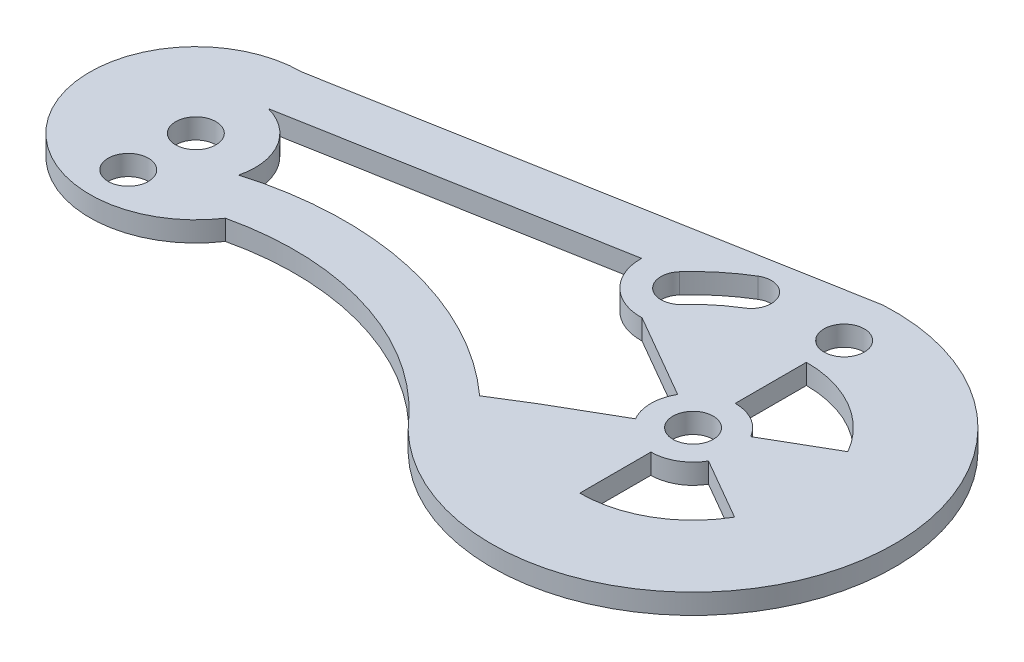
ISO-10303-21;
HEADER;
FILE_DESCRIPTION(('STEP AP214'),'2;1');
FILE_NAME('part.step','',(''),(''),'','','');
FILE_SCHEMA(('AUTOMOTIVE_DESIGN { 1 0 10303 214 1 1 1 1 }'));
ENDSEC;
DATA;
#1=APPLICATION_CONTEXT('core data for automotive mechanical design processes');
#2=APPLICATION_PROTOCOL_DEFINITION('international standard','automotive_design',2000,#1);
#3=PRODUCT_CONTEXT('',#1,'mechanical');
#4=PRODUCT('Part','Part','',(#3));
#5=PRODUCT_RELATED_PRODUCT_CATEGORY('part','',(#4));
#6=PRODUCT_DEFINITION_FORMATION('','',#4);
#7=PRODUCT_DEFINITION_CONTEXT('part definition',#1,'design');
#8=PRODUCT_DEFINITION('design','',#6,#7);
#9=PRODUCT_DEFINITION_SHAPE('','',#8);
#10=(LENGTH_UNIT() NAMED_UNIT(*) SI_UNIT(.MILLI.,.METRE.));
#11=(NAMED_UNIT(*) PLANE_ANGLE_UNIT() SI_UNIT($,.RADIAN.));
#12=(NAMED_UNIT(*) SI_UNIT($,.STERADIAN.) SOLID_ANGLE_UNIT());
#13=UNCERTAINTY_MEASURE_WITH_UNIT(LENGTH_MEASURE(1.E-05),#10,'distance_accuracy_value','');
#14=(GEOMETRIC_REPRESENTATION_CONTEXT(3) GLOBAL_UNCERTAINTY_ASSIGNED_CONTEXT((#13)) GLOBAL_UNIT_ASSIGNED_CONTEXT((#10,
#11,#12)) REPRESENTATION_CONTEXT('',''));
#15=CARTESIAN_POINT('',(0.,0.,0.));
#16=DIRECTION('',(0.,0.,1.));
#17=DIRECTION('',(1.,0.,0.));
#18=AXIS2_PLACEMENT_3D('',#15,#16,#17);
#19=CARTESIAN_POINT('',(16.3199445973894,2.,-0.0149493146589817));
#20=DIRECTION('',(0.,1.,0.));
#21=DIRECTION('',(0.,0.,1.));
#22=AXIS2_PLACEMENT_3D('',#19,#20,#21);
#23=PLANE('',#22);
#24=DIRECTION('',(0.866025403784441,0.,-0.499999999999995));
#25=VECTOR('',#24,1.);
#26=CARTESIAN_POINT('',(19.9455703845448,2.,-2.10820533885399));
#27=LINE('',#26,#25);
#28=CARTESIAN_POINT('',(19.9455703845448,2.,-2.10820533885399));
#29=VERTEX_POINT('',#28);
#30=CARTESIAN_POINT('',(26.0642912359516,2.,-5.64085046950984));
#31=VERTEX_POINT('',#30);
#32=EDGE_CURVE('E232',#29,#31,#27,.T.);
#33=ORIENTED_EDGE('',*,*,#32,.F.);
#34=CARTESIAN_POINT('',(16.3199445973894,2.,-0.0149493146589817));
#35=DIRECTION('',(0.,-1.,0.));
#36=DIRECTION('',(0.,0.,1.));
#37=AXIS2_PLACEMENT_3D('',#34,#35,#36);
#38=CIRCLE('',#37,4.18651204839007);
#39=CARTESIAN_POINT('',(16.3199445973894,2.,-4.20146136304906));
#40=VERTEX_POINT('',#39);
#41=EDGE_CURVE('E230',#40,#29,#38,.T.);
#42=ORIENTED_EDGE('',*,*,#41,.F.);
#43=DIRECTION('',(0.,0.,1.));
#44=VECTOR('',#43,1.);
#45=CARTESIAN_POINT('',(16.3199445973894,2.,-4.20146136304906));
#46=LINE('',#45,#44);
#47=CARTESIAN_POINT('',(16.3199445973894,2.,-11.2667516243608));
#48=VERTEX_POINT('',#47);
#49=EDGE_CURVE('E238',#48,#40,#46,.T.);
#50=ORIENTED_EDGE('',*,*,#49,.F.);
#51=CARTESIAN_POINT('',(16.3199445973894,2.,-0.0149493146589817));
#52=DIRECTION('',(0.,1.,0.));
#53=DIRECTION('',(0.,0.,1.));
#54=AXIS2_PLACEMENT_3D('',#51,#52,#53);
#55=CIRCLE('',#54,11.2518023097018);
#56=EDGE_CURVE('E235',#31,#48,#55,.T.);
#57=ORIENTED_EDGE('',*,*,#56,.F.);
#58=EDGE_LOOP('',(#33,#42,#50,#57));
#59=FACE_BOUND('',#58,.T.);
#60=CARTESIAN_POINT('',(16.3199445973896,2.,-15.0149493146594));
#61=DIRECTION('',(0.,1.,0.));
#62=DIRECTION('',(0.,0.,1.));
#63=AXIS2_PLACEMENT_3D('',#60,#61,#62);
#64=CIRCLE('',#63,2.);
#65=CARTESIAN_POINT('',(16.3199445973896,2.,-13.0149493146594));
#66=VERTEX_POINT('',#65);
#67=EDGE_CURVE('E320',#66,#66,#64,.T.);
#68=ORIENTED_EDGE('',*,*,#67,.F.);
#69=EDGE_LOOP('',(#68));
#70=FACE_BOUND('',#69,.T.);
#71=CARTESIAN_POINT('',(16.3199445973894,2.,-0.0149493146589817));
#72=DIRECTION('',(0.,-1.,0.));
#73=DIRECTION('',(0.,0.,1.));
#74=AXIS2_PLACEMENT_3D('',#71,#72,#73);
#75=CIRCLE('',#74,14.9944903727053);
#76=CARTESIAN_POINT('',(5.20602798210394,2.,-10.0805143264025));
#77=VERTEX_POINT('',#76);
#78=CARTESIAN_POINT('',(8.56935246180486,2.,-12.8509558231089));
#79=VERTEX_POINT('',#78);
#80=EDGE_CURVE('E337',#77,#79,#75,.T.);
#81=ORIENTED_EDGE('',*,*,#80,.F.);
#82=CARTESIAN_POINT('',(3.72538472664067,2.,-11.4214917210473));
#83=DIRECTION('',(0.,1.,0.));
#84=DIRECTION('',(0.,0.,1.));
#85=AXIS2_PLACEMENT_3D('',#82,#83,#84);
#86=CIRCLE('',#85,1.99762980126381);
#87=CARTESIAN_POINT('',(2.24474147117739,2.,-12.7624691156921));
#88=VERTEX_POINT('',#87);
#89=EDGE_CURVE('E334',#88,#77,#86,.T.);
#90=ORIENTED_EDGE('',*,*,#89,.F.);
#91=CARTESIAN_POINT('',(16.3199445973894,2.,-0.0149493146589817));
#92=DIRECTION('',(0.,1.,0.));
#93=DIRECTION('',(0.,0.,1.));
#94=AXIS2_PLACEMENT_3D('',#91,#92,#93);
#95=CIRCLE('',#94,18.989749975233);
#96=CARTESIAN_POINT('',(6.50421874366688,2.,-16.2710906183763));
#97=VERTEX_POINT('',#96);
#98=EDGE_CURVE('E332',#97,#88,#95,.T.);
#99=ORIENTED_EDGE('',*,*,#98,.F.);
#100=CARTESIAN_POINT('',(7.53678560273587,2.,-14.5610232207426));
#101=DIRECTION('',(0.,1.,0.));
#102=DIRECTION('',(0.,0.,1.));
#103=AXIS2_PLACEMENT_3D('',#100,#101,#102);
#104=CIRCLE('',#103,1.99762980126382);
#105=EDGE_CURVE('E339',#79,#97,#104,.T.);
#106=ORIENTED_EDGE('',*,*,#105,.F.);
#107=EDGE_LOOP('',(#81,#90,#99,#106));
#108=FACE_BOUND('',#107,.T.);
#109=CARTESIAN_POINT('',(-33.6760270550272,2.,-0.649629179440625));
#110=DIRECTION('',(0.,1.,0.));
#111=DIRECTION('',(0.,0.,1.));
#112=AXIS2_PLACEMENT_3D('',#109,#110,#111);
#113=CIRCLE('',#112,2.00000000000008);
#114=CARTESIAN_POINT('',(-33.6760270550272,2.,1.35037082055946));
#115=VERTEX_POINT('',#114);
#116=EDGE_CURVE('E369',#115,#115,#113,.T.);
#117=ORIENTED_EDGE('',*,*,#116,.F.);
#118=EDGE_LOOP('',(#117));
#119=FACE_BOUND('',#118,.T.);
#120=CARTESIAN_POINT('',(16.3199445973894,2.,-0.0149493146589817));
#121=DIRECTION('',(0.,1.,0.));
#122=DIRECTION('',(0.,0.,1.));
#123=AXIS2_PLACEMENT_3D('',#120,#121,#122);
#124=CIRCLE('',#123,20.);
#125=CARTESIAN_POINT('',(1.21179098720079,2.,13.0901525350385));
#126=VERTEX_POINT('',#125);
#127=CARTESIAN_POINT('',(15.2114066280616,2.,-19.9842042724829));
#128=VERTEX_POINT('',#127);
#129=EDGE_CURVE('E375',#126,#128,#124,.T.);
#130=ORIENTED_EDGE('',*,*,#129,.T.);
#131=DIRECTION('',(-0.984169688292326,0.,0.177228735386181));
#132=VECTOR('',#131,1.);
#133=CARTESIAN_POINT('',(-33.6760270550272,2.,-11.1805821420723));
#134=LINE('',#133,#132);
#135=CARTESIAN_POINT('',(-33.6760270550272,2.,-11.1805821420723));
#136=VERTEX_POINT('',#135);
#137=EDGE_CURVE('E378',#128,#136,#134,.T.);
#138=ORIENTED_EDGE('',*,*,#137,.T.);
#139=CARTESIAN_POINT('',(-33.6760270550272,2.,-0.649629179440625));
#140=DIRECTION('',(0.,1.,0.));
#141=DIRECTION('',(0.,0.,1.));
#142=AXIS2_PLACEMENT_3D('',#139,#140,#141);
#143=CIRCLE('',#142,10.5309529626316);
#144=CARTESIAN_POINT('',(-24.9123676121906,2.,5.189826571838));
#145=VERTEX_POINT('',#144);
#146=EDGE_CURVE('E381',#136,#145,#143,.T.);
#147=ORIENTED_EDGE('',*,*,#146,.T.);
#148=CARTESIAN_POINT('',(-18.7219674602419,2.,31.8627021017618));
#149=DIRECTION('',(0.,-1.,0.));
#150=DIRECTION('',(0.,0.,-1.));
#151=AXIS2_PLACEMENT_3D('',#148,#149,#150);
#152=CIRCLE('',#151,27.3818067898391);
#153=EDGE_CURVE('E383',#145,#126,#152,.T.);
#154=ORIENTED_EDGE('',*,*,#153,.T.);
#155=EDGE_LOOP('',(#130,#138,#147,#154));
#156=FACE_BOUND('',#155,.T.);
#157=CARTESIAN_POINT('',(-33.8862251489053,2.,5.84697122087106));
#158=DIRECTION('',(0.,1.,0.));
#159=DIRECTION('',(0.,0.,1.));
#160=AXIS2_PLACEMENT_3D('',#157,#158,#159);
#161=CIRCLE('',#160,2.00000000000009);
#162=CARTESIAN_POINT('',(-33.8862251489053,2.,7.84697122087116));
#163=VERTEX_POINT('',#162);
#164=EDGE_CURVE('E363',#163,#163,#161,.T.);
#165=ORIENTED_EDGE('',*,*,#164,.F.);
#166=EDGE_LOOP('',(#165));
#167=FACE_BOUND('',#166,.T.);
#168=CARTESIAN_POINT('',(16.3199445973894,2.,-0.0149493146589817));
#169=DIRECTION('',(0.,1.,0.));
#170=DIRECTION('',(0.,0.,1.));
#171=AXIS2_PLACEMENT_3D('',#168,#169,#170);
#172=CIRCLE('',#171,2.00000000000038);
#173=CARTESIAN_POINT('',(16.3199445973894,2.,1.9850506853414));
#174=VERTEX_POINT('',#173);
#175=EDGE_CURVE('E326',#174,#174,#172,.T.);
#176=ORIENTED_EDGE('',*,*,#175,.F.);
#177=EDGE_LOOP('',(#176));
#178=FACE_BOUND('',#177,.T.);
#179=DIRECTION('',(0.850040839509949,0.,-0.526716784586575));
#180=VECTOR('',#179,1.);
#181=CARTESIAN_POINT('',(6.57559795882709,2.,5.61095184019181));
#182=LINE('',#181,#180);
#183=CARTESIAN_POINT('',(2.98633728253268,2.,7.83499067996181));
#184=VERTEX_POINT('',#183);
#185=CARTESIAN_POINT('',(6.57559795882709,2.,5.61095184019181));
#186=VERTEX_POINT('',#185);
#187=EDGE_CURVE('E263',#184,#186,#182,.T.);
#188=ORIENTED_EDGE('',*,*,#187,.F.);
#189=CARTESIAN_POINT('',(-18.7219674602419,2.,31.8627021017618));
#190=DIRECTION('',(0.,-1.,0.));
#191=DIRECTION('',(0.,0.,-1.));
#192=AXIS2_PLACEMENT_3D('',#189,#190,#191);
#193=CIRCLE('',#192,32.3818067898391);
#194=CARTESIAN_POINT('',(-27.9625677954776,2.,0.827355858825978));
#195=VERTEX_POINT('',#194);
#196=EDGE_CURVE('E261',#195,#184,#193,.T.);
#197=ORIENTED_EDGE('',*,*,#196,.F.);
#198=CARTESIAN_POINT('',(-33.6760270550272,2.,-0.649629179440625));
#199=DIRECTION('',(0.,-1.,0.));
#200=DIRECTION('',(0.,0.,1.));
#201=AXIS2_PLACEMENT_3D('',#198,#199,#200);
#202=CIRCLE('',#201,5.90127965053317);
#203=CARTESIAN_POINT('',(-32.2059919289702,2.,-6.36488055116134));
#204=VERTEX_POINT('',#203);
#205=EDGE_CURVE('E277',#204,#195,#202,.T.);
#206=ORIENTED_EDGE('',*,*,#205,.F.);
#207=DIRECTION('',(-0.984169688292328,0.,0.177228735386174));
#208=VECTOR('',#207,1.);
#209=CARTESIAN_POINT('',(-32.2059919289702,2.,-6.36488055116134));
#210=LINE('',#209,#208);
#211=CARTESIAN_POINT('',(-0.796707678042967,2.,-12.0210471588076));
#212=VERTEX_POINT('',#211);
#213=EDGE_CURVE('E274',#212,#204,#210,.T.);
#214=ORIENTED_EDGE('',*,*,#213,.F.);
#215=CARTESIAN_POINT('',(4.19999064817985,2.,-11.9245615785259));
#216=DIRECTION('',(0.,-1.,0.));
#217=DIRECTION('',(0.,0.,1.));
#218=AXIS2_PLACEMENT_3D('',#215,#216,#217);
#219=CIRCLE('',#218,4.99762980126381);
#220=CARTESIAN_POINT('',(4.34442408796202,2.,-6.92901930446264));
#221=VERTEX_POINT('',#220);
#222=EDGE_CURVE('E272',#221,#212,#219,.T.);
#223=ORIENTED_EDGE('',*,*,#222,.F.);
#224=DIRECTION('',(-0.866025403784442,0.,-0.499999999999995));
#225=VECTOR('',#224,1.);
#226=CARTESIAN_POINT('',(12.6943188102339,2.,-2.10820533885399));
#227=LINE('',#226,#225);
#228=CARTESIAN_POINT('',(12.6943188102339,2.,-2.10820533885399));
#229=VERTEX_POINT('',#228);
#230=EDGE_CURVE('E270',#229,#221,#227,.T.);
#231=ORIENTED_EDGE('',*,*,#230,.F.);
#232=CARTESIAN_POINT('',(16.3199445973894,2.,-0.0149493146589817));
#233=DIRECTION('',(0.,-1.,0.));
#234=DIRECTION('',(0.,0.,1.));
#235=AXIS2_PLACEMENT_3D('',#232,#233,#234);
#236=CIRCLE('',#235,4.18651204839007);
#237=CARTESIAN_POINT('',(12.6943188102339,2.,2.07830670953601));
#238=VERTEX_POINT('',#237);
#239=EDGE_CURVE('E268',#238,#229,#236,.T.);
#240=ORIENTED_EDGE('',*,*,#239,.F.);
#241=DIRECTION('',(0.866025403784445,0.,-0.499999999999989));
#242=VECTOR('',#241,1.);
#243=CARTESIAN_POINT('',(12.6943188102339,2.,2.07830670953601));
#244=LINE('',#243,#242);
#245=EDGE_CURVE('E266',#186,#238,#244,.T.);
#246=ORIENTED_EDGE('',*,*,#245,.F.);
#247=EDGE_LOOP('',(#188,#197,#206,#214,#223,#231,#240,#246));
#248=FACE_BOUND('',#247,.T.);
#249=DIRECTION('',(0.,0.,1.));
#250=VECTOR('',#249,1.);
#251=CARTESIAN_POINT('',(16.3199445973893,2.,4.17156273373109));
#252=LINE('',#251,#250);
#253=CARTESIAN_POINT('',(16.3199445973893,2.,4.17156273373109));
#254=VERTEX_POINT('',#253);
#255=CARTESIAN_POINT('',(16.3199445973893,2.,11.2368529950429));
#256=VERTEX_POINT('',#255);
#257=EDGE_CURVE('E202',#254,#256,#252,.T.);
#258=ORIENTED_EDGE('',*,*,#257,.F.);
#259=CARTESIAN_POINT('',(16.3199445973894,2.,-0.0149493146589817));
#260=DIRECTION('',(0.,-1.,0.));
#261=DIRECTION('',(0.,0.,1.));
#262=AXIS2_PLACEMENT_3D('',#259,#260,#261);
#263=CIRCLE('',#262,4.18651204839007);
#264=CARTESIAN_POINT('',(19.9455703845448,2.,2.07830670953609));
#265=VERTEX_POINT('',#264);
#266=EDGE_CURVE('E194',#265,#254,#263,.T.);
#267=ORIENTED_EDGE('',*,*,#266,.F.);
#268=DIRECTION('',(-0.866025403784438,0.,-0.500000000000001));
#269=VECTOR('',#268,1.);
#270=CARTESIAN_POINT('',(19.9455703845448,2.,2.07830670953609));
#271=LINE('',#270,#269);
#272=CARTESIAN_POINT('',(26.0642912359516,2.,5.61095184019197));
#273=VERTEX_POINT('',#272);
#274=EDGE_CURVE('E216',#273,#265,#271,.T.);
#275=ORIENTED_EDGE('',*,*,#274,.F.);
#276=CARTESIAN_POINT('',(16.3199445973894,2.,-0.0149493146589817));
#277=DIRECTION('',(0.,1.,0.));
#278=DIRECTION('',(0.,0.,1.));
#279=AXIS2_PLACEMENT_3D('',#276,#277,#278);
#280=CIRCLE('',#279,11.2518023097018);
#281=EDGE_CURVE('E214',#256,#273,#280,.T.);
#282=ORIENTED_EDGE('',*,*,#281,.F.);
#283=EDGE_LOOP('',(#258,#267,#275,#282));
#284=FACE_BOUND('',#283,.T.);
#285=ADVANCED_FACE('F33',(#59,#70,#108,#119,#156,#167,#178,#248,#284),#23,.T.);
#286=CARTESIAN_POINT('',(16.3199445973894,0.,-0.0149493146589817));
#287=DIRECTION('',(0.,1.,0.));
#288=DIRECTION('',(0.,0.,1.));
#289=AXIS2_PLACEMENT_3D('',#286,#287,#288);
#290=PLANE('',#289);
#291=CARTESIAN_POINT('',(16.3199445973894,0.,-0.0149493146589817));
#292=DIRECTION('',(0.,-1.,0.));
#293=DIRECTION('',(0.,0.,1.));
#294=AXIS2_PLACEMENT_3D('',#291,#292,#293);
#295=CIRCLE('',#294,4.18651204839007);
#296=CARTESIAN_POINT('',(16.3199445973894,0.,-4.20146136304906));
#297=VERTEX_POINT('',#296);
#298=CARTESIAN_POINT('',(19.9455703845448,0.,-2.10820533885399));
#299=VERTEX_POINT('',#298);
#300=EDGE_CURVE('E210',#297,#299,#295,.T.);
#301=ORIENTED_EDGE('',*,*,#300,.T.);
#302=DIRECTION('',(0.866025403784441,0.,-0.499999999999995));
#303=VECTOR('',#302,1.);
#304=CARTESIAN_POINT('',(19.9455703845448,0.,-2.10820533885399));
#305=LINE('',#304,#303);
#306=CARTESIAN_POINT('',(26.0642912359516,0.,-5.64085046950984));
#307=VERTEX_POINT('',#306);
#308=EDGE_CURVE('E243',#299,#307,#305,.T.);
#309=ORIENTED_EDGE('',*,*,#308,.T.);
#310=CARTESIAN_POINT('',(16.3199445973894,0.,-0.0149493146589817));
#311=DIRECTION('',(0.,1.,0.));
#312=DIRECTION('',(0.,0.,1.));
#313=AXIS2_PLACEMENT_3D('',#310,#311,#312);
#314=CIRCLE('',#313,11.2518023097018);
#315=CARTESIAN_POINT('',(16.3199445973894,0.,-11.2667516243608));
#316=VERTEX_POINT('',#315);
#317=EDGE_CURVE('E246',#307,#316,#314,.T.);
#318=ORIENTED_EDGE('',*,*,#317,.T.);
#319=DIRECTION('',(0.,0.,1.));
#320=VECTOR('',#319,1.);
#321=CARTESIAN_POINT('',(16.3199445973894,0.,-4.20146136304906));
#322=LINE('',#321,#320);
#323=EDGE_CURVE('E233',#316,#297,#322,.T.);
#324=ORIENTED_EDGE('',*,*,#323,.T.);
#325=EDGE_LOOP('',(#301,#309,#318,#324));
#326=FACE_BOUND('',#325,.T.);
#327=CARTESIAN_POINT('',(16.3199445973896,0.,-15.0149493146594));
#328=DIRECTION('',(0.,1.,0.));
#329=DIRECTION('',(0.,0.,1.));
#330=AXIS2_PLACEMENT_3D('',#327,#328,#329);
#331=CIRCLE('',#330,2.);
#332=CARTESIAN_POINT('',(16.3199445973896,0.,-13.0149493146594));
#333=VERTEX_POINT('',#332);
#334=EDGE_CURVE('E319',#333,#333,#331,.T.);
#335=ORIENTED_EDGE('',*,*,#334,.T.);
#336=EDGE_LOOP('',(#335));
#337=FACE_BOUND('',#336,.T.);
#338=CARTESIAN_POINT('',(3.72538472664067,0.,-11.4214917210473));
#339=DIRECTION('',(0.,1.,0.));
#340=DIRECTION('',(0.,0.,1.));
#341=AXIS2_PLACEMENT_3D('',#338,#339,#340);
#342=CIRCLE('',#341,1.99762980126381);
#343=CARTESIAN_POINT('',(2.24474147117738,0.,-12.7624691156921));
#344=VERTEX_POINT('',#343);
#345=CARTESIAN_POINT('',(5.20602798210394,0.,-10.0805143264025));
#346=VERTEX_POINT('',#345);
#347=EDGE_CURVE('E329',#344,#346,#342,.T.);
#348=ORIENTED_EDGE('',*,*,#347,.T.);
#349=CARTESIAN_POINT('',(16.3199445973894,0.,-0.0149493146589817));
#350=DIRECTION('',(0.,-1.,0.));
#351=DIRECTION('',(0.,0.,-1.));
#352=AXIS2_PLACEMENT_3D('',#349,#350,#351);
#353=CIRCLE('',#352,14.9944903727053);
#354=CARTESIAN_POINT('',(8.56935246180486,0.,-12.8509558231089));
#355=VERTEX_POINT('',#354);
#356=EDGE_CURVE('E345',#346,#355,#353,.T.);
#357=ORIENTED_EDGE('',*,*,#356,.T.);
#358=CARTESIAN_POINT('',(7.53678560273587,0.,-14.5610232207426));
#359=DIRECTION('',(0.,1.,0.));
#360=DIRECTION('',(0.,0.,1.));
#361=AXIS2_PLACEMENT_3D('',#358,#359,#360);
#362=CIRCLE('',#361,1.99762980126382);
#363=CARTESIAN_POINT('',(6.50421874366687,0.,-16.2710906183763));
#364=VERTEX_POINT('',#363);
#365=EDGE_CURVE('E348',#355,#364,#362,.T.);
#366=ORIENTED_EDGE('',*,*,#365,.T.);
#367=CARTESIAN_POINT('',(16.3199445973894,0.,-0.0149493146589817));
#368=DIRECTION('',(0.,1.,0.));
#369=DIRECTION('',(0.,0.,1.));
#370=AXIS2_PLACEMENT_3D('',#367,#368,#369);
#371=CIRCLE('',#370,18.989749975233);
#372=EDGE_CURVE('E335',#364,#344,#371,.T.);
#373=ORIENTED_EDGE('',*,*,#372,.T.);
#374=EDGE_LOOP('',(#348,#357,#366,#373));
#375=FACE_BOUND('',#374,.T.);
#376=CARTESIAN_POINT('',(-33.6760270550272,0.,-0.649629179440625));
#377=DIRECTION('',(0.,1.,0.));
#378=DIRECTION('',(0.,0.,1.));
#379=AXIS2_PLACEMENT_3D('',#376,#377,#378);
#380=CIRCLE('',#379,2.00000000000008);
#381=CARTESIAN_POINT('',(-33.6760270550272,0.,1.35037082055946));
#382=VERTEX_POINT('',#381);
#383=EDGE_CURVE('E366',#382,#382,#380,.T.);
#384=ORIENTED_EDGE('',*,*,#383,.T.);
#385=EDGE_LOOP('',(#384));
#386=FACE_BOUND('',#385,.T.);
#387=CARTESIAN_POINT('',(16.3199445973894,0.,-0.0149493146589817));
#388=DIRECTION('',(0.,1.,0.));
#389=DIRECTION('',(0.,0.,1.));
#390=AXIS2_PLACEMENT_3D('',#387,#388,#389);
#391=CIRCLE('',#390,20.);
#392=CARTESIAN_POINT('',(1.21179098720079,0.,13.0901525350385));
#393=VERTEX_POINT('',#392);
#394=CARTESIAN_POINT('',(15.2114066280616,0.,-19.9842042724829));
#395=VERTEX_POINT('',#394);
#396=EDGE_CURVE('E372',#393,#395,#391,.T.);
#397=ORIENTED_EDGE('',*,*,#396,.F.);
#398=CARTESIAN_POINT('',(-18.7219674602419,0.,31.8627021017618));
#399=DIRECTION('',(0.,-1.,0.));
#400=DIRECTION('',(0.,0.,-1.));
#401=AXIS2_PLACEMENT_3D('',#398,#399,#400);
#402=CIRCLE('',#401,27.3818067898391);
#403=CARTESIAN_POINT('',(-24.9123676121906,0.,5.189826571838));
#404=VERTEX_POINT('',#403);
#405=EDGE_CURVE('E379',#404,#393,#402,.T.);
#406=ORIENTED_EDGE('',*,*,#405,.F.);
#407=CARTESIAN_POINT('',(-33.6760270550272,0.,-0.649629179440625));
#408=DIRECTION('',(0.,1.,0.));
#409=DIRECTION('',(0.,0.,1.));
#410=AXIS2_PLACEMENT_3D('',#407,#408,#409);
#411=CIRCLE('',#410,10.5309529626316);
#412=CARTESIAN_POINT('',(-33.6760270550272,0.,-11.1805821420723));
#413=VERTEX_POINT('',#412);
#414=EDGE_CURVE('E390',#413,#404,#411,.T.);
#415=ORIENTED_EDGE('',*,*,#414,.F.);
#416=DIRECTION('',(-0.984169688292326,0.,0.177228735386181));
#417=VECTOR('',#416,1.);
#418=CARTESIAN_POINT('',(-33.6760270550272,0.,-11.1805821420723));
#419=LINE('',#418,#417);
#420=EDGE_CURVE('E388',#395,#413,#419,.T.);
#421=ORIENTED_EDGE('',*,*,#420,.F.);
#422=EDGE_LOOP('',(#397,#406,#415,#421));
#423=FACE_BOUND('',#422,.T.);
#424=CARTESIAN_POINT('',(-33.8862251489053,0.,5.84697122087106));
#425=DIRECTION('',(0.,1.,0.));
#426=DIRECTION('',(0.,0.,1.));
#427=AXIS2_PLACEMENT_3D('',#424,#425,#426);
#428=CIRCLE('',#427,2.00000000000009);
#429=CARTESIAN_POINT('',(-33.8862251489053,0.,7.84697122087116));
#430=VERTEX_POINT('',#429);
#431=EDGE_CURVE('E362',#430,#430,#428,.T.);
#432=ORIENTED_EDGE('',*,*,#431,.T.);
#433=EDGE_LOOP('',(#432));
#434=FACE_BOUND('',#433,.T.);
#435=CARTESIAN_POINT('',(16.3199445973894,0.,-0.0149493146589817));
#436=DIRECTION('',(0.,1.,0.));
#437=DIRECTION('',(0.,0.,1.));
#438=AXIS2_PLACEMENT_3D('',#435,#436,#437);
#439=CIRCLE('',#438,2.00000000000038);
#440=CARTESIAN_POINT('',(16.3199445973894,0.,1.9850506853414));
#441=VERTEX_POINT('',#440);
#442=EDGE_CURVE('E323',#441,#441,#439,.T.);
#443=ORIENTED_EDGE('',*,*,#442,.T.);
#444=EDGE_LOOP('',(#443));
#445=FACE_BOUND('',#444,.T.);
#446=CARTESIAN_POINT('',(-18.7219674602419,0.,31.8627021017618));
#447=DIRECTION('',(0.,-1.,0.));
#448=DIRECTION('',(0.,0.,-1.));
#449=AXIS2_PLACEMENT_3D('',#446,#447,#448);
#450=CIRCLE('',#449,32.3818067898391);
#451=CARTESIAN_POINT('',(-27.9625677954776,0.,0.827355858825977));
#452=VERTEX_POINT('',#451);
#453=CARTESIAN_POINT('',(2.98633728253268,0.,7.83499067996181));
#454=VERTEX_POINT('',#453);
#455=EDGE_CURVE('E260',#452,#454,#450,.T.);
#456=ORIENTED_EDGE('',*,*,#455,.T.);
#457=DIRECTION('',(0.850040839509949,0.,-0.526716784586575));
#458=VECTOR('',#457,1.);
#459=CARTESIAN_POINT('',(6.57559795882709,0.,5.61095184019181));
#460=LINE('',#459,#458);
#461=CARTESIAN_POINT('',(6.57559795882709,0.,5.61095184019181));
#462=VERTEX_POINT('',#461);
#463=EDGE_CURVE('E282',#454,#462,#460,.T.);
#464=ORIENTED_EDGE('',*,*,#463,.T.);
#465=DIRECTION('',(0.866025403784445,0.,-0.499999999999989));
#466=VECTOR('',#465,1.);
#467=CARTESIAN_POINT('',(12.6943188102339,0.,2.07830670953601));
#468=LINE('',#467,#466);
#469=CARTESIAN_POINT('',(12.6943188102339,0.,2.07830670953601));
#470=VERTEX_POINT('',#469);
#471=EDGE_CURVE('E285',#462,#470,#468,.T.);
#472=ORIENTED_EDGE('',*,*,#471,.T.);
#473=CARTESIAN_POINT('',(16.3199445973894,0.,-0.0149493146589817));
#474=DIRECTION('',(0.,-1.,0.));
#475=DIRECTION('',(0.,0.,1.));
#476=AXIS2_PLACEMENT_3D('',#473,#474,#475);
#477=CIRCLE('',#476,4.18651204839007);
#478=CARTESIAN_POINT('',(12.6943188102339,0.,-2.10820533885399));
#479=VERTEX_POINT('',#478);
#480=EDGE_CURVE('E288',#470,#479,#477,.T.);
#481=ORIENTED_EDGE('',*,*,#480,.T.);
#482=DIRECTION('',(-0.866025403784442,0.,-0.499999999999995));
#483=VECTOR('',#482,1.);
#484=CARTESIAN_POINT('',(12.6943188102339,0.,-2.10820533885399));
#485=LINE('',#484,#483);
#486=CARTESIAN_POINT('',(4.34442408796202,0.,-6.92901930446264));
#487=VERTEX_POINT('',#486);
#488=EDGE_CURVE('E291',#479,#487,#485,.T.);
#489=ORIENTED_EDGE('',*,*,#488,.T.);
#490=CARTESIAN_POINT('',(4.19999064817985,0.,-11.9245615785259));
#491=DIRECTION('',(0.,-1.,0.));
#492=DIRECTION('',(0.,0.,1.));
#493=AXIS2_PLACEMENT_3D('',#490,#491,#492);
#494=CIRCLE('',#493,4.99762980126381);
#495=CARTESIAN_POINT('',(-0.796707678042967,0.,-12.0210471588076));
#496=VERTEX_POINT('',#495);
#497=EDGE_CURVE('E294',#487,#496,#494,.T.);
#498=ORIENTED_EDGE('',*,*,#497,.T.);
#499=DIRECTION('',(-0.984169688292328,0.,0.177228735386174));
#500=VECTOR('',#499,1.);
#501=CARTESIAN_POINT('',(-32.2059919289702,0.,-6.36488055116134));
#502=LINE('',#501,#500);
#503=CARTESIAN_POINT('',(-32.2059919289702,0.,-6.36488055116134));
#504=VERTEX_POINT('',#503);
#505=EDGE_CURVE('E297',#496,#504,#502,.T.);
#506=ORIENTED_EDGE('',*,*,#505,.T.);
#507=CARTESIAN_POINT('',(-33.6760270550272,0.,-0.649629179440625));
#508=DIRECTION('',(0.,-1.,0.));
#509=DIRECTION('',(0.,0.,1.));
#510=AXIS2_PLACEMENT_3D('',#507,#508,#509);
#511=CIRCLE('',#510,5.90127965053317);
#512=EDGE_CURVE('E264',#504,#452,#511,.T.);
#513=ORIENTED_EDGE('',*,*,#512,.T.);
#514=EDGE_LOOP('',(#456,#464,#472,#481,#489,#498,#506,#513));
#515=FACE_BOUND('',#514,.T.);
#516=CARTESIAN_POINT('',(16.3199445973894,0.,-0.0149493146589817));
#517=DIRECTION('',(0.,-1.,0.));
#518=DIRECTION('',(0.,0.,1.));
#519=AXIS2_PLACEMENT_3D('',#516,#517,#518);
#520=CIRCLE('',#519,4.18651204839007);
#521=CARTESIAN_POINT('',(19.9455703845448,0.,2.07830670953609));
#522=VERTEX_POINT('',#521);
#523=CARTESIAN_POINT('',(16.3199445973893,0.,4.17156273373109));
#524=VERTEX_POINT('',#523);
#525=EDGE_CURVE('E56',#522,#524,#520,.T.);
#526=ORIENTED_EDGE('',*,*,#525,.T.);
#527=DIRECTION('',(0.,0.,1.));
#528=VECTOR('',#527,1.);
#529=CARTESIAN_POINT('',(16.3199445973893,0.,4.17156273373109));
#530=LINE('',#529,#528);
#531=CARTESIAN_POINT('',(16.3199445973893,0.,11.2368529950429));
#532=VERTEX_POINT('',#531);
#533=EDGE_CURVE('E209',#524,#532,#530,.T.);
#534=ORIENTED_EDGE('',*,*,#533,.T.);
#535=CARTESIAN_POINT('',(16.3199445973894,0.,-0.0149493146589817));
#536=DIRECTION('',(0.,1.,0.));
#537=DIRECTION('',(0.,0.,1.));
#538=AXIS2_PLACEMENT_3D('',#535,#536,#537);
#539=CIRCLE('',#538,11.2518023097018);
#540=CARTESIAN_POINT('',(26.0642912359516,0.,5.61095184019197));
#541=VERTEX_POINT('',#540);
#542=EDGE_CURVE('E222',#532,#541,#539,.T.);
#543=ORIENTED_EDGE('',*,*,#542,.T.);
#544=DIRECTION('',(-0.866025403784438,0.,-0.500000000000001));
#545=VECTOR('',#544,1.);
#546=CARTESIAN_POINT('',(19.9455703845448,0.,2.07830670953609));
#547=LINE('',#546,#545);
#548=EDGE_CURVE('E203',#541,#522,#547,.T.);
#549=ORIENTED_EDGE('',*,*,#548,.T.);
#550=EDGE_LOOP('',(#526,#534,#543,#549));
#551=FACE_BOUND('',#550,.T.);
#552=ADVANCED_FACE('F408',(#326,#337,#375,#386,#423,#434,#445,#515,#551),#290,.F.);
#553=CARTESIAN_POINT('',(16.3199445973894,2.,-0.0149493146589817));
#554=DIRECTION('',(0.,-1.,0.));
#555=DIRECTION('',(0.,0.,-1.));
#556=AXIS2_PLACEMENT_3D('',#553,#554,#555);
#557=CYLINDRICAL_SURFACE('',#556,20.);
#558=ORIENTED_EDGE('',*,*,#396,.T.);
#559=DIRECTION('',(0.,-1.,0.));
#560=VECTOR('',#559,1.);
#561=CARTESIAN_POINT('',(15.2114066280616,2.,-19.9842042724829));
#562=LINE('',#561,#560);
#563=EDGE_CURVE('E11',#128,#395,#562,.T.);
#564=ORIENTED_EDGE('',*,*,#563,.F.);
#565=ORIENTED_EDGE('',*,*,#129,.F.);
#566=DIRECTION('',(0.,-1.,0.));
#567=VECTOR('',#566,1.);
#568=CARTESIAN_POINT('',(1.21179098720079,2.,13.0901525350385));
#569=LINE('',#568,#567);
#570=EDGE_CURVE('E385',#126,#393,#569,.T.);
#571=ORIENTED_EDGE('',*,*,#570,.T.);
#572=EDGE_LOOP('',(#558,#564,#565,#571));
#573=FACE_BOUND('',#572,.T.);
#574=ADVANCED_FACE('F35',(#573),#557,.T.);
#575=CARTESIAN_POINT('',(-33.6760270550272,2.,-11.1805821420723));
#576=DIRECTION('',(0.177228735386181,0.,0.984169688292326));
#577=DIRECTION('',(0.984169688292327,0.,-0.177228735386181));
#578=AXIS2_PLACEMENT_3D('',#575,#576,#577);
#579=PLANE('',#578);
#580=ORIENTED_EDGE('',*,*,#420,.T.);
#581=DIRECTION('',(0.,-1.,0.));
#582=VECTOR('',#581,1.);
#583=CARTESIAN_POINT('',(-33.6760270550272,2.,-11.1805821420723));
#584=LINE('',#583,#582);
#585=EDGE_CURVE('E41',#136,#413,#584,.T.);
#586=ORIENTED_EDGE('',*,*,#585,.F.);
#587=ORIENTED_EDGE('',*,*,#137,.F.);
#588=ORIENTED_EDGE('',*,*,#563,.T.);
#589=EDGE_LOOP('',(#580,#586,#587,#588));
#590=FACE_BOUND('',#589,.T.);
#591=ADVANCED_FACE('F419',(#590),#579,.F.);
#592=CARTESIAN_POINT('',(-33.6760270550272,2.,-0.649629179440625));
#593=DIRECTION('',(0.,-1.,0.));
#594=DIRECTION('',(0.,0.,-1.));
#595=AXIS2_PLACEMENT_3D('',#592,#593,#594);
#596=CYLINDRICAL_SURFACE('',#595,10.5309529626316);
#597=ORIENTED_EDGE('',*,*,#414,.T.);
#598=DIRECTION('',(0.,-1.,0.));
#599=VECTOR('',#598,1.);
#600=CARTESIAN_POINT('',(-24.9123676121906,2.,5.189826571838));
#601=LINE('',#600,#599);
#602=EDGE_CURVE('E395',#145,#404,#601,.T.);
#603=ORIENTED_EDGE('',*,*,#602,.F.);
#604=ORIENTED_EDGE('',*,*,#146,.F.);
#605=ORIENTED_EDGE('',*,*,#585,.T.);
#606=EDGE_LOOP('',(#597,#603,#604,#605));
#607=FACE_BOUND('',#606,.T.);
#608=ADVANCED_FACE('F402',(#607),#596,.T.);
#609=CARTESIAN_POINT('',(-18.7219674602419,2.,31.8627021017618));
#610=DIRECTION('',(0.,-1.,0.));
#611=DIRECTION('',(0.,0.,-1.));
#612=AXIS2_PLACEMENT_3D('',#609,#610,#611);
#613=CYLINDRICAL_SURFACE('',#612,27.3818067898391);
#614=ORIENTED_EDGE('',*,*,#405,.T.);
#615=ORIENTED_EDGE('',*,*,#570,.F.);
#616=ORIENTED_EDGE('',*,*,#153,.F.);
#617=ORIENTED_EDGE('',*,*,#602,.T.);
#618=EDGE_LOOP('',(#614,#615,#616,#617));
#619=FACE_BOUND('',#618,.T.);
#620=ADVANCED_FACE('F412',(#619),#613,.F.);
#621=CARTESIAN_POINT('',(-33.6760270550272,2.,-0.649629179440625));
#622=DIRECTION('',(0.,-1.,0.));
#623=DIRECTION('',(0.,0.,-1.));
#624=AXIS2_PLACEMENT_3D('',#621,#622,#623);
#625=CYLINDRICAL_SURFACE('',#624,2.00000000000008);
#626=ORIENTED_EDGE('',*,*,#116,.T.);
#627=EDGE_LOOP('',(#626));
#628=FACE_BOUND('',#627,.T.);
#629=ORIENTED_EDGE('',*,*,#383,.F.);
#630=EDGE_LOOP('',(#629));
#631=FACE_BOUND('',#630,.T.);
#632=ADVANCED_FACE('F437',(#628,#631),#625,.F.);
#633=CARTESIAN_POINT('',(-33.8862251489053,2.,5.84697122087106));
#634=DIRECTION('',(0.,-1.,0.));
#635=DIRECTION('',(0.,0.,-1.));
#636=AXIS2_PLACEMENT_3D('',#633,#634,#635);
#637=CYLINDRICAL_SURFACE('',#636,2.00000000000009);
#638=ORIENTED_EDGE('',*,*,#164,.T.);
#639=EDGE_LOOP('',(#638));
#640=FACE_BOUND('',#639,.T.);
#641=ORIENTED_EDGE('',*,*,#431,.F.);
#642=EDGE_LOOP('',(#641));
#643=FACE_BOUND('',#642,.T.);
#644=ADVANCED_FACE('F444',(#640,#643),#637,.F.);
#645=CARTESIAN_POINT('',(3.72538472664067,2.,-11.4214917210473));
#646=DIRECTION('',(0.,-1.,0.));
#647=DIRECTION('',(0.,0.,-1.));
#648=AXIS2_PLACEMENT_3D('',#645,#646,#647);
#649=CYLINDRICAL_SURFACE('',#648,1.99762980126381);
#650=ORIENTED_EDGE('',*,*,#347,.F.);
#651=DIRECTION('',(0.,-1.,0.));
#652=VECTOR('',#651,1.);
#653=CARTESIAN_POINT('',(2.24474147117739,2.,-12.7624691156921));
#654=LINE('',#653,#652);
#655=EDGE_CURVE('E360',#88,#344,#654,.T.);
#656=ORIENTED_EDGE('',*,*,#655,.F.);
#657=ORIENTED_EDGE('',*,*,#89,.T.);
#658=DIRECTION('',(0.,-1.,0.));
#659=VECTOR('',#658,1.);
#660=CARTESIAN_POINT('',(5.20602798210394,2.,-10.0805143264025));
#661=LINE('',#660,#659);
#662=EDGE_CURVE('E357',#77,#346,#661,.T.);
#663=ORIENTED_EDGE('',*,*,#662,.T.);
#664=EDGE_LOOP('',(#650,#656,#657,#663));
#665=FACE_BOUND('',#664,.T.);
#666=ADVANCED_FACE('F449',(#665),#649,.F.);
#667=CARTESIAN_POINT('',(16.3199445973894,2.,-0.0149493146589817));
#668=DIRECTION('',(0.,-1.,0.));
#669=DIRECTION('',(0.,0.,-1.));
#670=AXIS2_PLACEMENT_3D('',#667,#668,#669);
#671=CYLINDRICAL_SURFACE('',#670,14.9944903727053);
#672=ORIENTED_EDGE('',*,*,#356,.F.);
#673=ORIENTED_EDGE('',*,*,#662,.F.);
#674=ORIENTED_EDGE('',*,*,#80,.T.);
#675=DIRECTION('',(0.,-1.,0.));
#676=VECTOR('',#675,1.);
#677=CARTESIAN_POINT('',(8.56935246180486,2.,-12.8509558231089));
#678=LINE('',#677,#676);
#679=EDGE_CURVE('E355',#79,#355,#678,.T.);
#680=ORIENTED_EDGE('',*,*,#679,.T.);
#681=EDGE_LOOP('',(#672,#673,#674,#680));
#682=FACE_BOUND('',#681,.T.);
#683=ADVANCED_FACE('F459',(#682),#671,.T.);
#684=CARTESIAN_POINT('',(7.53678560273587,2.,-14.5610232207426));
#685=DIRECTION('',(0.,-1.,0.));
#686=DIRECTION('',(0.,0.,-1.));
#687=AXIS2_PLACEMENT_3D('',#684,#685,#686);
#688=CYLINDRICAL_SURFACE('',#687,1.99762980126382);
#689=ORIENTED_EDGE('',*,*,#365,.F.);
#690=ORIENTED_EDGE('',*,*,#679,.F.);
#691=ORIENTED_EDGE('',*,*,#105,.T.);
#692=DIRECTION('',(0.,-1.,0.));
#693=VECTOR('',#692,1.);
#694=CARTESIAN_POINT('',(6.50421874366687,2.,-16.2710906183763));
#695=LINE('',#694,#693);
#696=EDGE_CURVE('E342',#97,#364,#695,.T.);
#697=ORIENTED_EDGE('',*,*,#696,.T.);
#698=EDGE_LOOP('',(#689,#690,#691,#697));
#699=FACE_BOUND('',#698,.T.);
#700=ADVANCED_FACE('F466',(#699),#688,.F.);
#701=CARTESIAN_POINT('',(16.3199445973894,2.,-0.0149493146589817));
#702=DIRECTION('',(0.,-1.,0.));
#703=DIRECTION('',(0.,0.,-1.));
#704=AXIS2_PLACEMENT_3D('',#701,#702,#703);
#705=CYLINDRICAL_SURFACE('',#704,18.989749975233);
#706=ORIENTED_EDGE('',*,*,#372,.F.);
#707=ORIENTED_EDGE('',*,*,#696,.F.);
#708=ORIENTED_EDGE('',*,*,#98,.T.);
#709=ORIENTED_EDGE('',*,*,#655,.T.);
#710=EDGE_LOOP('',(#706,#707,#708,#709));
#711=FACE_BOUND('',#710,.T.);
#712=ADVANCED_FACE('F470',(#711),#705,.F.);
#713=CARTESIAN_POINT('',(16.3199445973894,2.,-0.0149493146589817));
#714=DIRECTION('',(0.,-1.,0.));
#715=DIRECTION('',(0.,0.,-1.));
#716=AXIS2_PLACEMENT_3D('',#713,#714,#715);
#717=CYLINDRICAL_SURFACE('',#716,2.00000000000038);
#718=ORIENTED_EDGE('',*,*,#175,.T.);
#719=EDGE_LOOP('',(#718));
#720=FACE_BOUND('',#719,.T.);
#721=ORIENTED_EDGE('',*,*,#442,.F.);
#722=EDGE_LOOP('',(#721));
#723=FACE_BOUND('',#722,.T.);
#724=ADVANCED_FACE('F474',(#720,#723),#717,.F.);
#725=CARTESIAN_POINT('',(16.3199445973896,2.,-15.0149493146594));
#726=DIRECTION('',(0.,-1.,0.));
#727=DIRECTION('',(0.,0.,-1.));
#728=AXIS2_PLACEMENT_3D('',#725,#726,#727);
#729=CYLINDRICAL_SURFACE('',#728,2.);
#730=ORIENTED_EDGE('',*,*,#67,.T.);
#731=EDGE_LOOP('',(#730));
#732=FACE_BOUND('',#731,.T.);
#733=ORIENTED_EDGE('',*,*,#334,.F.);
#734=EDGE_LOOP('',(#733));
#735=FACE_BOUND('',#734,.T.);
#736=ADVANCED_FACE('F478',(#732,#735),#729,.F.);
#737=CARTESIAN_POINT('',(-18.7219674602419,2.,31.8627021017618));
#738=DIRECTION('',(0.,-1.,0.));
#739=DIRECTION('',(0.,0.,-1.));
#740=AXIS2_PLACEMENT_3D('',#737,#738,#739);
#741=CYLINDRICAL_SURFACE('',#740,32.3818067898391);
#742=ORIENTED_EDGE('',*,*,#455,.F.);
#743=DIRECTION('',(0.,-1.,0.));
#744=VECTOR('',#743,1.);
#745=CARTESIAN_POINT('',(-27.9625677954776,2.,0.827355858825978));
#746=LINE('',#745,#744);
#747=EDGE_CURVE('E279',#195,#452,#746,.T.);
#748=ORIENTED_EDGE('',*,*,#747,.F.);
#749=ORIENTED_EDGE('',*,*,#196,.T.);
#750=DIRECTION('',(0.,-1.,0.));
#751=VECTOR('',#750,1.);
#752=CARTESIAN_POINT('',(2.98633728253268,2.,7.83499067996181));
#753=LINE('',#752,#751);
#754=EDGE_CURVE('E316',#184,#454,#753,.T.);
#755=ORIENTED_EDGE('',*,*,#754,.T.);
#756=EDGE_LOOP('',(#742,#748,#749,#755));
#757=FACE_BOUND('',#756,.T.);
#758=ADVANCED_FACE('F482',(#757),#741,.T.);
#759=CARTESIAN_POINT('',(6.57559795882709,2.,5.61095184019181));
#760=DIRECTION('',(-0.526716784586575,0.,-0.850040839509949));
#761=DIRECTION('',(-0.850040839509949,0.,0.526716784586575));
#762=AXIS2_PLACEMENT_3D('',#759,#760,#761);
#763=PLANE('',#762);
#764=ORIENTED_EDGE('',*,*,#463,.F.);
#765=ORIENTED_EDGE('',*,*,#754,.F.);
#766=ORIENTED_EDGE('',*,*,#187,.T.);
#767=DIRECTION('',(0.,-1.,0.));
#768=VECTOR('',#767,1.);
#769=CARTESIAN_POINT('',(6.57559795882709,2.,5.61095184019181));
#770=LINE('',#769,#768);
#771=EDGE_CURVE('E314',#186,#462,#770,.T.);
#772=ORIENTED_EDGE('',*,*,#771,.T.);
#773=EDGE_LOOP('',(#764,#765,#766,#772));
#774=FACE_BOUND('',#773,.T.);
#775=ADVANCED_FACE('F486',(#774),#763,.T.);
#776=CARTESIAN_POINT('',(12.6943188102339,2.,2.07830670953601));
#777=DIRECTION('',(-0.499999999999989,0.,-0.866025403784445));
#778=DIRECTION('',(-0.866025403784445,0.,0.499999999999989));
#779=AXIS2_PLACEMENT_3D('',#776,#777,#778);
#780=PLANE('',#779);
#781=ORIENTED_EDGE('',*,*,#471,.F.);
#782=ORIENTED_EDGE('',*,*,#771,.F.);
#783=ORIENTED_EDGE('',*,*,#245,.T.);
#784=DIRECTION('',(0.,-1.,0.));
#785=VECTOR('',#784,1.);
#786=CARTESIAN_POINT('',(12.6943188102339,2.,2.07830670953601));
#787=LINE('',#786,#785);
#788=EDGE_CURVE('E312',#238,#470,#787,.T.);
#789=ORIENTED_EDGE('',*,*,#788,.T.);
#790=EDGE_LOOP('',(#781,#782,#783,#789));
#791=FACE_BOUND('',#790,.T.);
#792=ADVANCED_FACE('F490',(#791),#780,.T.);
#793=CARTESIAN_POINT('',(16.3199445973894,2.,-0.0149493146589817));
#794=DIRECTION('',(0.,-1.,0.));
#795=DIRECTION('',(0.,0.,-1.));
#796=AXIS2_PLACEMENT_3D('',#793,#794,#795);
#797=CYLINDRICAL_SURFACE('',#796,4.18651204839007);
#798=ORIENTED_EDGE('',*,*,#480,.F.);
#799=ORIENTED_EDGE('',*,*,#788,.F.);
#800=ORIENTED_EDGE('',*,*,#239,.T.);
#801=DIRECTION('',(0.,-1.,0.));
#802=VECTOR('',#801,1.);
#803=CARTESIAN_POINT('',(12.6943188102339,2.,-2.10820533885399));
#804=LINE('',#803,#802);
#805=EDGE_CURVE('E310',#229,#479,#804,.T.);
#806=ORIENTED_EDGE('',*,*,#805,.T.);
#807=EDGE_LOOP('',(#798,#799,#800,#806));
#808=FACE_BOUND('',#807,.T.);
#809=ADVANCED_FACE('F494',(#808),#797,.T.);
#810=CARTESIAN_POINT('',(12.6943188102339,2.,-2.10820533885399));
#811=DIRECTION('',(-0.499999999999995,0.,0.866025403784442));
#812=DIRECTION('',(0.866025403784442,0.,0.499999999999995));
#813=AXIS2_PLACEMENT_3D('',#810,#811,#812);
#814=PLANE('',#813);
#815=ORIENTED_EDGE('',*,*,#488,.F.);
#816=ORIENTED_EDGE('',*,*,#805,.F.);
#817=ORIENTED_EDGE('',*,*,#230,.T.);
#818=DIRECTION('',(0.,-1.,0.));
#819=VECTOR('',#818,1.);
#820=CARTESIAN_POINT('',(4.34442408796202,2.,-6.92901930446264));
#821=LINE('',#820,#819);
#822=EDGE_CURVE('E308',#221,#487,#821,.T.);
#823=ORIENTED_EDGE('',*,*,#822,.T.);
#824=EDGE_LOOP('',(#815,#816,#817,#823));
#825=FACE_BOUND('',#824,.T.);
#826=ADVANCED_FACE('F498',(#825),#814,.T.);
#827=CARTESIAN_POINT('',(4.19999064817985,2.,-11.9245615785259));
#828=DIRECTION('',(0.,-1.,0.));
#829=DIRECTION('',(0.,0.,-1.));
#830=AXIS2_PLACEMENT_3D('',#827,#828,#829);
#831=CYLINDRICAL_SURFACE('',#830,4.99762980126381);
#832=ORIENTED_EDGE('',*,*,#497,.F.);
#833=ORIENTED_EDGE('',*,*,#822,.F.);
#834=ORIENTED_EDGE('',*,*,#222,.T.);
#835=DIRECTION('',(0.,-1.,0.));
#836=VECTOR('',#835,1.);
#837=CARTESIAN_POINT('',(-0.796707678042967,2.,-12.0210471588076));
#838=LINE('',#837,#836);
#839=EDGE_CURVE('E306',#212,#496,#838,.T.);
#840=ORIENTED_EDGE('',*,*,#839,.T.);
#841=EDGE_LOOP('',(#832,#833,#834,#840));
#842=FACE_BOUND('',#841,.T.);
#843=ADVANCED_FACE('F502',(#842),#831,.T.);
#844=CARTESIAN_POINT('',(-32.2059919289702,2.,-6.36488055116134));
#845=DIRECTION('',(0.177228735386174,0.,0.984169688292328));
#846=DIRECTION('',(0.984169688292328,0.,-0.177228735386174));
#847=AXIS2_PLACEMENT_3D('',#844,#845,#846);
#848=PLANE('',#847);
#849=ORIENTED_EDGE('',*,*,#505,.F.);
#850=ORIENTED_EDGE('',*,*,#839,.F.);
#851=ORIENTED_EDGE('',*,*,#213,.T.);
#852=DIRECTION('',(0.,-1.,0.));
#853=VECTOR('',#852,1.);
#854=CARTESIAN_POINT('',(-32.2059919289702,2.,-6.36488055116134));
#855=LINE('',#854,#853);
#856=EDGE_CURVE('E304',#204,#504,#855,.T.);
#857=ORIENTED_EDGE('',*,*,#856,.T.);
#858=EDGE_LOOP('',(#849,#850,#851,#857));
#859=FACE_BOUND('',#858,.T.);
#860=ADVANCED_FACE('F506',(#859),#848,.T.);
#861=CARTESIAN_POINT('',(-33.6760270550272,2.,-0.649629179440625));
#862=DIRECTION('',(0.,-1.,0.));
#863=DIRECTION('',(0.,0.,-1.));
#864=AXIS2_PLACEMENT_3D('',#861,#862,#863);
#865=CYLINDRICAL_SURFACE('',#864,5.90127965053317);
#866=ORIENTED_EDGE('',*,*,#512,.F.);
#867=ORIENTED_EDGE('',*,*,#856,.F.);
#868=ORIENTED_EDGE('',*,*,#205,.T.);
#869=ORIENTED_EDGE('',*,*,#747,.T.);
#870=EDGE_LOOP('',(#866,#867,#868,#869));
#871=FACE_BOUND('',#870,.T.);
#872=ADVANCED_FACE('F510',(#871),#865,.T.);
#873=CARTESIAN_POINT('',(16.3199445973894,2.,-0.0149493146589817));
#874=DIRECTION('',(0.,-1.,0.));
#875=DIRECTION('',(0.,0.,-1.));
#876=AXIS2_PLACEMENT_3D('',#873,#874,#875);
#877=CYLINDRICAL_SURFACE('',#876,4.18651204839007);
#878=ORIENTED_EDGE('',*,*,#300,.F.);
#879=DIRECTION('',(0.,-1.,0.));
#880=VECTOR('',#879,1.);
#881=CARTESIAN_POINT('',(16.3199445973894,2.,-4.20146136304906));
#882=LINE('',#881,#880);
#883=EDGE_CURVE('E240',#40,#297,#882,.T.);
#884=ORIENTED_EDGE('',*,*,#883,.F.);
#885=ORIENTED_EDGE('',*,*,#41,.T.);
#886=DIRECTION('',(0.,-1.,0.));
#887=VECTOR('',#886,1.);
#888=CARTESIAN_POINT('',(19.9455703845448,2.,-2.10820533885399));
#889=LINE('',#888,#887);
#890=EDGE_CURVE('E257',#29,#299,#889,.T.);
#891=ORIENTED_EDGE('',*,*,#890,.T.);
#892=EDGE_LOOP('',(#878,#884,#885,#891));
#893=FACE_BOUND('',#892,.T.);
#894=ADVANCED_FACE('F514',(#893),#877,.T.);
#895=CARTESIAN_POINT('',(19.9455703845448,2.,-2.10820533885399));
#896=DIRECTION('',(-0.499999999999995,0.,-0.866025403784442));
#897=DIRECTION('',(-0.866025403784442,0.,0.499999999999995));
#898=AXIS2_PLACEMENT_3D('',#895,#896,#897);
#899=PLANE('',#898);
#900=ORIENTED_EDGE('',*,*,#308,.F.);
#901=ORIENTED_EDGE('',*,*,#890,.F.);
#902=ORIENTED_EDGE('',*,*,#32,.T.);
#903=DIRECTION('',(0.,-1.,0.));
#904=VECTOR('',#903,1.);
#905=CARTESIAN_POINT('',(26.0642912359516,2.,-5.64085046950984));
#906=LINE('',#905,#904);
#907=EDGE_CURVE('E255',#31,#307,#906,.T.);
#908=ORIENTED_EDGE('',*,*,#907,.T.);
#909=EDGE_LOOP('',(#900,#901,#902,#908));
#910=FACE_BOUND('',#909,.T.);
#911=ADVANCED_FACE('F518',(#910),#899,.T.);
#912=CARTESIAN_POINT('',(16.3199445973894,2.,-0.0149493146589817));
#913=DIRECTION('',(0.,-1.,0.));
#914=DIRECTION('',(0.,0.,-1.));
#915=AXIS2_PLACEMENT_3D('',#912,#913,#914);
#916=CYLINDRICAL_SURFACE('',#915,11.2518023097018);
#917=ORIENTED_EDGE('',*,*,#317,.F.);
#918=ORIENTED_EDGE('',*,*,#907,.F.);
#919=ORIENTED_EDGE('',*,*,#56,.T.);
#920=DIRECTION('',(0.,-1.,0.));
#921=VECTOR('',#920,1.);
#922=CARTESIAN_POINT('',(16.3199445973894,2.,-11.2667516243608));
#923=LINE('',#922,#921);
#924=EDGE_CURVE('E253',#48,#316,#923,.T.);
#925=ORIENTED_EDGE('',*,*,#924,.T.);
#926=EDGE_LOOP('',(#917,#918,#919,#925));
#927=FACE_BOUND('',#926,.T.);
#928=ADVANCED_FACE('F522',(#927),#916,.F.);
#929=CARTESIAN_POINT('',(16.3199445973894,2.,-4.20146136304906));
#930=DIRECTION('',(1.,0.,0.));
#931=DIRECTION('',(0.,0.,-1.));
#932=AXIS2_PLACEMENT_3D('',#929,#930,#931);
#933=PLANE('',#932);
#934=ORIENTED_EDGE('',*,*,#323,.F.);
#935=ORIENTED_EDGE('',*,*,#924,.F.);
#936=ORIENTED_EDGE('',*,*,#49,.T.);
#937=ORIENTED_EDGE('',*,*,#883,.T.);
#938=EDGE_LOOP('',(#934,#935,#936,#937));
#939=FACE_BOUND('',#938,.T.);
#940=ADVANCED_FACE('F526',(#939),#933,.T.);
#941=CARTESIAN_POINT('',(16.3199445973894,2.,-0.0149493146589817));
#942=DIRECTION('',(0.,-1.,0.));
#943=DIRECTION('',(0.,0.,-1.));
#944=AXIS2_PLACEMENT_3D('',#941,#942,#943);
#945=CYLINDRICAL_SURFACE('',#944,4.18651204839007);
#946=ORIENTED_EDGE('',*,*,#525,.F.);
#947=DIRECTION('',(0.,-1.,0.));
#948=VECTOR('',#947,1.);
#949=CARTESIAN_POINT('',(19.9455703845448,2.,2.07830670953609));
#950=LINE('',#949,#948);
#951=EDGE_CURVE('E198',#265,#522,#950,.T.);
#952=ORIENTED_EDGE('',*,*,#951,.F.);
#953=ORIENTED_EDGE('',*,*,#266,.T.);
#954=DIRECTION('',(0.,-1.,0.));
#955=VECTOR('',#954,1.);
#956=CARTESIAN_POINT('',(16.3199445973893,2.,4.17156273373109));
#957=LINE('',#956,#955);
#958=EDGE_CURVE('E197',#254,#524,#957,.T.);
#959=ORIENTED_EDGE('',*,*,#958,.T.);
#960=EDGE_LOOP('',(#946,#952,#953,#959));
#961=FACE_BOUND('',#960,.T.);
#962=ADVANCED_FACE('F196',(#961),#945,.T.);
#963=CARTESIAN_POINT('',(16.3199445973893,2.,4.17156273373109));
#964=DIRECTION('',(1.,0.,0.));
#965=DIRECTION('',(0.,0.,-1.));
#966=AXIS2_PLACEMENT_3D('',#963,#964,#965);
#967=PLANE('',#966);
#968=ORIENTED_EDGE('',*,*,#533,.F.);
#969=ORIENTED_EDGE('',*,*,#958,.F.);
#970=ORIENTED_EDGE('',*,*,#257,.T.);
#971=DIRECTION('',(0.,-1.,0.));
#972=VECTOR('',#971,1.);
#973=CARTESIAN_POINT('',(16.3199445973893,2.,11.2368529950429));
#974=LINE('',#973,#972);
#975=EDGE_CURVE('E211',#256,#532,#974,.T.);
#976=ORIENTED_EDGE('',*,*,#975,.T.);
#977=EDGE_LOOP('',(#968,#969,#970,#976));
#978=FACE_BOUND('',#977,.T.);
#979=ADVANCED_FACE('F206',(#978),#967,.T.);
#980=CARTESIAN_POINT('',(16.3199445973894,2.,-0.0149493146589817));
#981=DIRECTION('',(0.,-1.,0.));
#982=DIRECTION('',(0.,0.,-1.));
#983=AXIS2_PLACEMENT_3D('',#980,#981,#982);
#984=CYLINDRICAL_SURFACE('',#983,11.2518023097018);
#985=ORIENTED_EDGE('',*,*,#542,.F.);
#986=ORIENTED_EDGE('',*,*,#975,.F.);
#987=ORIENTED_EDGE('',*,*,#281,.T.);
#988=DIRECTION('',(0.,-1.,0.));
#989=VECTOR('',#988,1.);
#990=CARTESIAN_POINT('',(26.0642912359516,2.,5.61095184019197));
#991=LINE('',#990,#989);
#992=EDGE_CURVE('E48',#273,#541,#991,.T.);
#993=ORIENTED_EDGE('',*,*,#992,.T.);
#994=EDGE_LOOP('',(#985,#986,#987,#993));
#995=FACE_BOUND('',#994,.T.);
#996=ADVANCED_FACE('F535',(#995),#984,.F.);
#997=CARTESIAN_POINT('',(19.9455703845448,2.,2.07830670953609));
#998=DIRECTION('',(-0.500000000000001,0.,0.866025403784438));
#999=DIRECTION('',(0.866025403784438,0.,0.500000000000001));
#1000=AXIS2_PLACEMENT_3D('',#997,#998,#999);
#1001=PLANE('',#1000);
#1002=ORIENTED_EDGE('',*,*,#548,.F.);
#1003=ORIENTED_EDGE('',*,*,#992,.F.);
#1004=ORIENTED_EDGE('',*,*,#274,.T.);
#1005=ORIENTED_EDGE('',*,*,#951,.T.);
#1006=EDGE_LOOP('',(#1002,#1003,#1004,#1005));
#1007=FACE_BOUND('',#1006,.T.);
#1008=ADVANCED_FACE('F538',(#1007),#1001,.T.);
#1009=CLOSED_SHELL('',(#285,#552,#574,#591,#608,#620,#632,#644,#666,#683,#700,#712,#724,#736,
#758,#775,#792,#809,#826,#843,#860,#872,#894,#911,#928,#940,#962,#979,#996,#1008));
#1010=MANIFOLD_SOLID_BREP('B2',#1009);
#1011=ADVANCED_BREP_SHAPE_REPRESENTATION('',(#18,#1010),#14);
#1012=SHAPE_DEFINITION_REPRESENTATION(#9,#1011);
ENDSEC;
END-ISO-10303-21;
